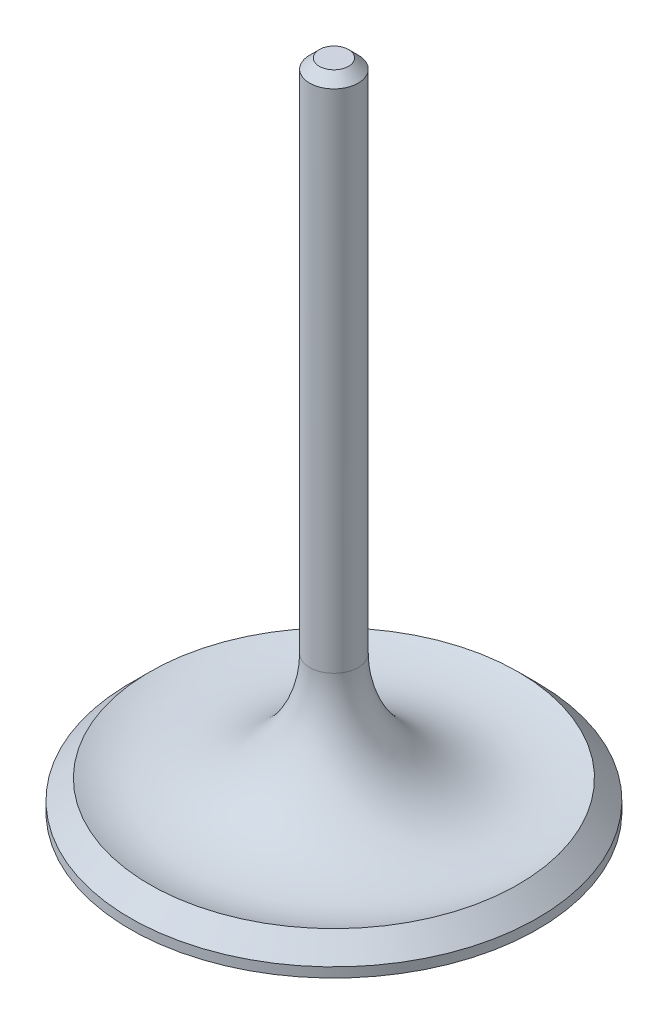
ISO-10303-21;
HEADER;
FILE_DESCRIPTION(('STEP AP214'),'2;1');
FILE_NAME('part.step','',(''),(''),'','','');
FILE_SCHEMA(('AUTOMOTIVE_DESIGN { 1 0 10303 214 1 1 1 1 }'));
ENDSEC;
DATA;
#1=APPLICATION_CONTEXT('core data for automotive mechanical design processes');
#2=APPLICATION_PROTOCOL_DEFINITION('international standard','automotive_design',2000,#1);
#3=PRODUCT_CONTEXT('',#1,'mechanical');
#4=PRODUCT('Part','Part','',(#3));
#5=PRODUCT_RELATED_PRODUCT_CATEGORY('part','',(#4));
#6=PRODUCT_DEFINITION_FORMATION('','',#4);
#7=PRODUCT_DEFINITION_CONTEXT('part definition',#1,'design');
#8=PRODUCT_DEFINITION('design','',#6,#7);
#9=PRODUCT_DEFINITION_SHAPE('','',#8);
#10=(LENGTH_UNIT() NAMED_UNIT(*) SI_UNIT(.MILLI.,.METRE.));
#11=(NAMED_UNIT(*) PLANE_ANGLE_UNIT() SI_UNIT($,.RADIAN.));
#12=(NAMED_UNIT(*) SI_UNIT($,.STERADIAN.) SOLID_ANGLE_UNIT());
#13=UNCERTAINTY_MEASURE_WITH_UNIT(LENGTH_MEASURE(1.E-05),#10,'distance_accuracy_value','');
#14=(GEOMETRIC_REPRESENTATION_CONTEXT(3) GLOBAL_UNCERTAINTY_ASSIGNED_CONTEXT((#13)) GLOBAL_UNIT_ASSIGNED_CONTEXT((#10,
#11,#12)) REPRESENTATION_CONTEXT('',''));
#15=CARTESIAN_POINT('',(0.,0.,0.));
#16=DIRECTION('',(0.,0.,1.));
#17=DIRECTION('',(1.,0.,0.));
#18=AXIS2_PLACEMENT_3D('',#15,#16,#17);
#19=CARTESIAN_POINT('',(26.67,0.,0.));
#20=DIRECTION('',(0.,-1.,0.));
#21=DIRECTION('',(0.,0.,-1.));
#22=AXIS2_PLACEMENT_3D('',#19,#20,#21);
#23=PLANE('',#22);
#24=CARTESIAN_POINT('',(0.,0.,0.));
#25=DIRECTION('',(0.,-1.,0.));
#26=DIRECTION('',(0.,0.,-1.));
#27=AXIS2_PLACEMENT_3D('',#24,#25,#26);
#28=CIRCLE('',#27,26.67);
#29=CARTESIAN_POINT('',(0.,0.,-26.67));
#30=VERTEX_POINT('',#29);
#31=EDGE_CURVE('E59',#30,#30,#28,.T.);
#32=ORIENTED_EDGE('',*,*,#31,.T.);
#33=EDGE_LOOP('',(#32));
#34=FACE_BOUND('',#33,.T.);
#35=ADVANCED_FACE('F45',(#34),#23,.T.);
#36=CARTESIAN_POINT('',(0.,0.,0.));
#37=DIRECTION('',(0.,-1.,0.));
#38=DIRECTION('',(0.,0.,-1.));
#39=AXIS2_PLACEMENT_3D('',#36,#37,#38);
#40=CYLINDRICAL_SURFACE('',#39,26.67);
#41=CARTESIAN_POINT('',(0.,1.27,0.));
#42=DIRECTION('',(0.,-1.,0.));
#43=DIRECTION('',(0.,0.,-1.));
#44=AXIS2_PLACEMENT_3D('',#41,#42,#43);
#45=CIRCLE('',#44,26.67);
#46=CARTESIAN_POINT('',(0.,1.27,-26.67));
#47=VERTEX_POINT('',#46);
#48=EDGE_CURVE('E64',#47,#47,#45,.T.);
#49=ORIENTED_EDGE('',*,*,#48,.T.);
#50=EDGE_LOOP('',(#49));
#51=FACE_BOUND('',#50,.T.);
#52=ORIENTED_EDGE('',*,*,#31,.F.);
#53=EDGE_LOOP('',(#52));
#54=FACE_BOUND('',#53,.T.);
#55=ADVANCED_FACE('F94',(#51,#54),#40,.T.);
#56=CARTESIAN_POINT('',(0.,1.27,0.));
#57=DIRECTION('',(0.,-1.,0.));
#58=DIRECTION('',(0.,0.,-1.));
#59=AXIS2_PLACEMENT_3D('',#56,#57,#58);
#60=CONICAL_SURFACE('',#59,26.67,0.785398163397454);
#61=CARTESIAN_POINT('',(0.,3.81,0.));
#62=DIRECTION('',(0.,-1.,0.));
#63=DIRECTION('',(0.,0.,-1.));
#64=AXIS2_PLACEMENT_3D('',#61,#62,#63);
#65=CIRCLE('',#64,24.13);
#66=CARTESIAN_POINT('',(0.,3.81,-24.13));
#67=VERTEX_POINT('',#66);
#68=EDGE_CURVE('E70',#67,#67,#65,.T.);
#69=ORIENTED_EDGE('',*,*,#68,.T.);
#70=EDGE_LOOP('',(#69));
#71=FACE_BOUND('',#70,.T.);
#72=ORIENTED_EDGE('',*,*,#48,.F.);
#73=EDGE_LOOP('',(#72));
#74=FACE_BOUND('',#73,.T.);
#75=ADVANCED_FACE('F91',(#71,#74),#60,.T.);
#76=CARTESIAN_POINT('',(0.,17.9546986535592,0.));
#77=DIRECTION('',(0.,-1.,0.));
#78=DIRECTION('',(0.,0.,-1.));
#79=AXIS2_PLACEMENT_3D('',#76,#77,#78);
#80=TOROIDAL_SURFACE('',#79,18.43,15.25);
#81=CARTESIAN_POINT('',(0.,17.9546986535592,0.));
#82=DIRECTION('',(0.,-1.,0.));
#83=DIRECTION('',(0.,0.,-1.));
#84=AXIS2_PLACEMENT_3D('',#81,#82,#83);
#85=CIRCLE('',#84,3.18000000000001);
#86=CARTESIAN_POINT('',(0.,17.9546986535592,-3.18000000000001));
#87=VERTEX_POINT('',#86);
#88=EDGE_CURVE('E74',#87,#87,#85,.T.);
#89=ORIENTED_EDGE('',*,*,#88,.T.);
#90=EDGE_LOOP('',(#89));
#91=FACE_BOUND('',#90,.T.);
#92=ORIENTED_EDGE('',*,*,#68,.F.);
#93=EDGE_LOOP('',(#92));
#94=FACE_BOUND('',#93,.T.);
#95=ADVANCED_FACE('F79',(#91,#94),#80,.F.);
#96=CARTESIAN_POINT('',(0.,0.,0.));
#97=DIRECTION('',(0.,-1.,0.));
#98=DIRECTION('',(0.,0.,-1.));
#99=AXIS2_PLACEMENT_3D('',#96,#97,#98);
#100=CYLINDRICAL_SURFACE('',#99,3.18);
#101=CARTESIAN_POINT('',(0.,84.23,0.));
#102=DIRECTION('',(0.,1.,0.));
#103=DIRECTION('',(0.,0.,1.));
#104=AXIS2_PLACEMENT_3D('',#101,#102,#103);
#105=CIRCLE('',#104,3.18);
#106=CARTESIAN_POINT('',(0.,84.23,3.18));
#107=VERTEX_POINT('',#106);
#108=EDGE_CURVE('E54',#107,#107,#105,.F.);
#109=ORIENTED_EDGE('',*,*,#108,.T.);
#110=EDGE_LOOP('',(#109));
#111=FACE_BOUND('',#110,.T.);
#112=ORIENTED_EDGE('',*,*,#88,.F.);
#113=EDGE_LOOP('',(#112));
#114=FACE_BOUND('',#113,.T.);
#115=ADVANCED_FACE('F82',(#111,#114),#100,.T.);
#116=CARTESIAN_POINT('',(0.,85.5,0.));
#117=DIRECTION('',(0.,1.,0.));
#118=DIRECTION('',(0.,0.,1.));
#119=AXIS2_PLACEMENT_3D('',#116,#117,#118);
#120=PLANE('',#119);
#121=CARTESIAN_POINT('',(0.,85.5,0.));
#122=DIRECTION('',(0.,1.,0.));
#123=DIRECTION('',(0.,0.,1.));
#124=AXIS2_PLACEMENT_3D('',#121,#122,#123);
#125=CIRCLE('',#124,1.91);
#126=CARTESIAN_POINT('',(0.,85.5,1.91));
#127=VERTEX_POINT('',#126);
#128=EDGE_CURVE('E10',#127,#127,#125,.T.);
#129=ORIENTED_EDGE('',*,*,#128,.T.);
#130=EDGE_LOOP('',(#129));
#131=FACE_BOUND('',#130,.T.);
#132=ADVANCED_FACE('F84',(#131),#120,.T.);
#133=CARTESIAN_POINT('',(0.,84.23,0.));
#134=DIRECTION('',(0.,-1.,0.));
#135=DIRECTION('',(0.,0.,-1.));
#136=AXIS2_PLACEMENT_3D('',#133,#134,#135);
#137=CONICAL_SURFACE('',#136,3.18,0.785398163397444);
#138=ORIENTED_EDGE('',*,*,#128,.F.);
#139=EDGE_LOOP('',(#138));
#140=FACE_BOUND('',#139,.T.);
#141=ORIENTED_EDGE('',*,*,#108,.F.);
#142=EDGE_LOOP('',(#141));
#143=FACE_BOUND('',#142,.T.);
#144=ADVANCED_FACE('F48',(#140,#143),#137,.T.);
#145=CLOSED_SHELL('',(#35,#55,#75,#95,#115,#132,#144));
#146=MANIFOLD_SOLID_BREP('B2',#145);
#147=ADVANCED_BREP_SHAPE_REPRESENTATION('',(#18,#146),#14);
#148=SHAPE_DEFINITION_REPRESENTATION(#9,#147);
ENDSEC;
END-ISO-10303-21;
